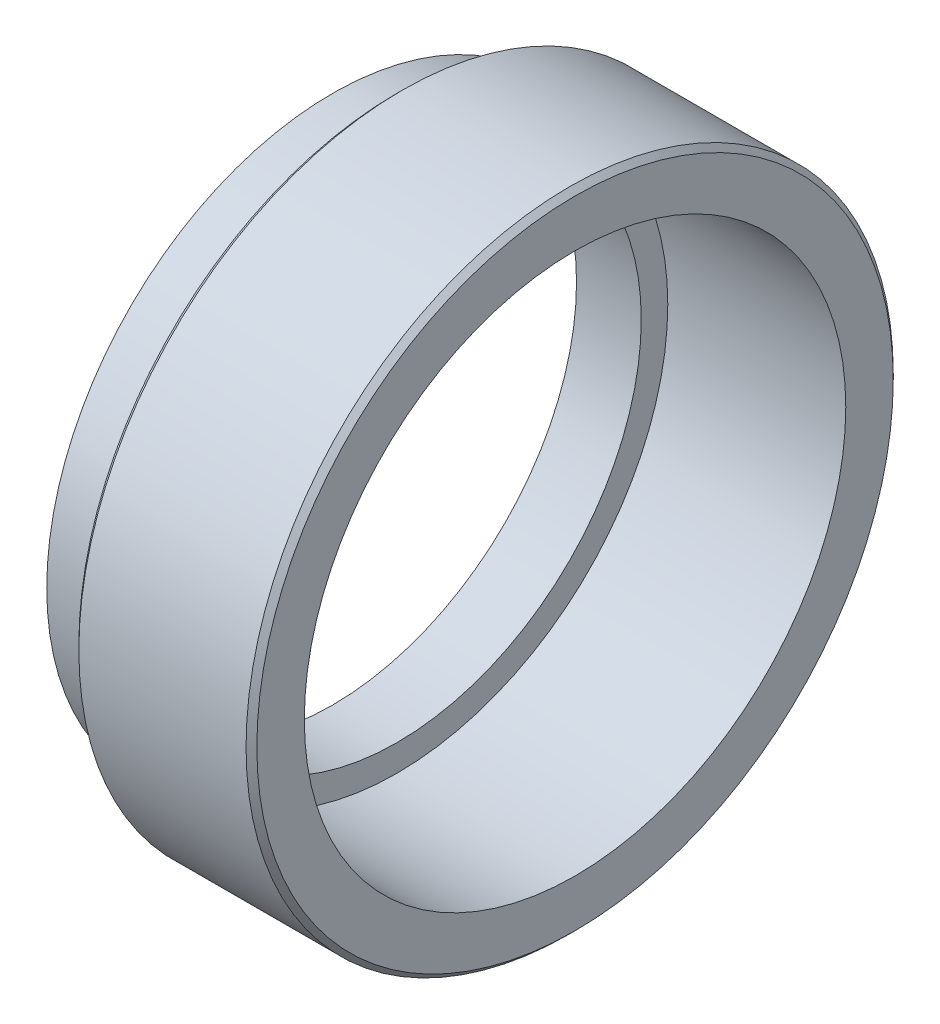
ISO-10303-21;
HEADER;
FILE_DESCRIPTION(('STEP AP214'),'2;1');
FILE_NAME('part.step','',(''),(''),'','','');
FILE_SCHEMA(('AUTOMOTIVE_DESIGN { 1 0 10303 214 1 1 1 1 }'));
ENDSEC;
DATA;
#1=APPLICATION_CONTEXT('core data for automotive mechanical design processes');
#2=APPLICATION_PROTOCOL_DEFINITION('international standard','automotive_design',2000,#1);
#3=PRODUCT_CONTEXT('',#1,'mechanical');
#4=PRODUCT('Part','Part','',(#3));
#5=PRODUCT_RELATED_PRODUCT_CATEGORY('part','',(#4));
#6=PRODUCT_DEFINITION_FORMATION('','',#4);
#7=PRODUCT_DEFINITION_CONTEXT('part definition',#1,'design');
#8=PRODUCT_DEFINITION('design','',#6,#7);
#9=PRODUCT_DEFINITION_SHAPE('','',#8);
#10=(LENGTH_UNIT() NAMED_UNIT(*) SI_UNIT(.MILLI.,.METRE.));
#11=(NAMED_UNIT(*) PLANE_ANGLE_UNIT() SI_UNIT($,.RADIAN.));
#12=(NAMED_UNIT(*) SI_UNIT($,.STERADIAN.) SOLID_ANGLE_UNIT());
#13=UNCERTAINTY_MEASURE_WITH_UNIT(LENGTH_MEASURE(1.E-05),#10,'distance_accuracy_value','');
#14=(GEOMETRIC_REPRESENTATION_CONTEXT(3) GLOBAL_UNCERTAINTY_ASSIGNED_CONTEXT((#13)) GLOBAL_UNIT_ASSIGNED_CONTEXT((#10,
#11,#12)) REPRESENTATION_CONTEXT('',''));
#15=CARTESIAN_POINT('',(0.,0.,0.));
#16=DIRECTION('',(0.,0.,1.));
#17=DIRECTION('',(1.,0.,0.));
#18=AXIS2_PLACEMENT_3D('',#15,#16,#17);
#19=CARTESIAN_POINT('',(0.,15.24,0.));
#20=DIRECTION('',(1.,0.,0.));
#21=DIRECTION('',(0.,0.,-1.));
#22=AXIS2_PLACEMENT_3D('',#19,#20,#21);
#23=PLANE('',#22);
#24=CARTESIAN_POINT('',(0.,0.,0.));
#25=DIRECTION('',(1.,0.,0.));
#26=DIRECTION('',(0.,0.,-1.));
#27=AXIS2_PLACEMENT_3D('',#24,#25,#26);
#28=CIRCLE('',#27,14.986);
#29=CARTESIAN_POINT('',(0.,0.,-14.986));
#30=VERTEX_POINT('',#29);
#31=EDGE_CURVE('E10',#30,#30,#28,.T.);
#32=ORIENTED_EDGE('',*,*,#31,.T.);
#33=EDGE_LOOP('',(#32));
#34=FACE_BOUND('',#33,.T.);
#35=CARTESIAN_POINT('',(0.,0.,0.));
#36=DIRECTION('',(1.,0.,0.));
#37=DIRECTION('',(0.,0.,-1.));
#38=AXIS2_PLACEMENT_3D('',#35,#36,#37);
#39=CIRCLE('',#38,12.75);
#40=CARTESIAN_POINT('',(0.,0.,-12.75));
#41=VERTEX_POINT('',#40);
#42=EDGE_CURVE('E66',#41,#41,#39,.T.);
#43=ORIENTED_EDGE('',*,*,#42,.F.);
#44=EDGE_LOOP('',(#43));
#45=FACE_BOUND('',#44,.T.);
#46=ADVANCED_FACE('F41',(#34,#45),#23,.T.);
#47=CARTESIAN_POINT('',(0.,0.,0.));
#48=DIRECTION('',(1.,0.,0.));
#49=DIRECTION('',(0.,0.,-1.));
#50=AXIS2_PLACEMENT_3D('',#47,#48,#49);
#51=CYLINDRICAL_SURFACE('',#50,15.24);
#52=CARTESIAN_POINT('',(-8.128,0.,0.));
#53=DIRECTION('',(-1.,0.,0.));
#54=DIRECTION('',(0.,0.,1.));
#55=AXIS2_PLACEMENT_3D('',#52,#53,#54);
#56=CIRCLE('',#55,15.24);
#57=CARTESIAN_POINT('',(-8.128,0.,15.24));
#58=VERTEX_POINT('',#57);
#59=EDGE_CURVE('E54',#58,#58,#56,.F.);
#60=ORIENTED_EDGE('',*,*,#59,.T.);
#61=EDGE_LOOP('',(#60));
#62=FACE_BOUND('',#61,.T.);
#63=CARTESIAN_POINT('',(-0.254000000000003,0.,0.));
#64=DIRECTION('',(1.,0.,0.));
#65=DIRECTION('',(0.,0.,-1.));
#66=AXIS2_PLACEMENT_3D('',#63,#64,#65);
#67=CIRCLE('',#66,15.24);
#68=CARTESIAN_POINT('',(-0.254000000000003,0.,-15.24));
#69=VERTEX_POINT('',#68);
#70=EDGE_CURVE('E60',#69,#69,#67,.F.);
#71=ORIENTED_EDGE('',*,*,#70,.T.);
#72=EDGE_LOOP('',(#71));
#73=FACE_BOUND('',#72,.T.);
#74=ADVANCED_FACE('F107',(#62,#73),#51,.T.);
#75=CARTESIAN_POINT('',(-11.43,13.1445,0.));
#76=DIRECTION('',(-1.,0.,0.));
#77=DIRECTION('',(0.,0.,1.));
#78=AXIS2_PLACEMENT_3D('',#75,#76,#77);
#79=PLANE('',#78);
#80=CARTESIAN_POINT('',(-11.43,0.,0.));
#81=DIRECTION('',(-1.,0.,0.));
#82=DIRECTION('',(0.,0.,1.));
#83=AXIS2_PLACEMENT_3D('',#80,#81,#82);
#84=CIRCLE('',#83,13.45);
#85=CARTESIAN_POINT('',(-11.43,0.,13.45));
#86=VERTEX_POINT('',#85);
#87=EDGE_CURVE('E69',#86,#86,#84,.T.);
#88=ORIENTED_EDGE('',*,*,#87,.T.);
#89=EDGE_LOOP('',(#88));
#90=FACE_BOUND('',#89,.T.);
#91=CARTESIAN_POINT('',(-11.43,0.,0.));
#92=DIRECTION('',(-1.,0.,0.));
#93=DIRECTION('',(0.,0.,1.));
#94=AXIS2_PLACEMENT_3D('',#91,#92,#93);
#95=CIRCLE('',#94,11.5);
#96=CARTESIAN_POINT('',(-11.43,0.,11.5));
#97=VERTEX_POINT('',#96);
#98=EDGE_CURVE('E78',#97,#97,#95,.T.);
#99=ORIENTED_EDGE('',*,*,#98,.F.);
#100=EDGE_LOOP('',(#99));
#101=FACE_BOUND('',#100,.T.);
#102=ADVANCED_FACE('F112',(#90,#101),#79,.T.);
#103=CARTESIAN_POINT('',(-8.128,0.,0.));
#104=DIRECTION('',(1.,0.,0.));
#105=DIRECTION('',(0.,0.,-1.));
#106=AXIS2_PLACEMENT_3D('',#103,#104,#105);
#107=CONICAL_SURFACE('',#106,15.24,0.785398163397452);
#108=CARTESIAN_POINT('',(-8.382,0.,0.));
#109=DIRECTION('',(-1.,0.,0.));
#110=DIRECTION('',(0.,0.,1.));
#111=AXIS2_PLACEMENT_3D('',#108,#109,#110);
#112=CIRCLE('',#111,14.986);
#113=CARTESIAN_POINT('',(-8.382,0.,14.986));
#114=VERTEX_POINT('',#113);
#115=EDGE_CURVE('E49',#114,#114,#112,.T.);
#116=ORIENTED_EDGE('',*,*,#115,.F.);
#117=EDGE_LOOP('',(#116));
#118=FACE_BOUND('',#117,.T.);
#119=ORIENTED_EDGE('',*,*,#59,.F.);
#120=EDGE_LOOP('',(#119));
#121=FACE_BOUND('',#120,.T.);
#122=ADVANCED_FACE('F103',(#118,#121),#107,.T.);
#123=CARTESIAN_POINT('',(0.,0.,0.));
#124=DIRECTION('',(-1.,0.,0.));
#125=DIRECTION('',(0.,0.,1.));
#126=AXIS2_PLACEMENT_3D('',#123,#124,#125);
#127=CONICAL_SURFACE('',#126,14.986,0.785398163397438);
#128=ORIENTED_EDGE('',*,*,#70,.F.);
#129=EDGE_LOOP('',(#128));
#130=FACE_BOUND('',#129,.T.);
#131=ORIENTED_EDGE('',*,*,#31,.F.);
#132=EDGE_LOOP('',(#131));
#133=FACE_BOUND('',#132,.T.);
#134=ADVANCED_FACE('F43',(#130,#133),#127,.T.);
#135=CARTESIAN_POINT('',(39.5979797464467,0.,0.));
#136=DIRECTION('',(-1.,0.,0.));
#137=DIRECTION('',(0.,0.,1.));
#138=AXIS2_PLACEMENT_3D('',#135,#136,#137);
#139=CYLINDRICAL_SURFACE('',#138,12.75);
#140=ORIENTED_EDGE('',*,*,#42,.T.);
#141=EDGE_LOOP('',(#140));
#142=FACE_BOUND('',#141,.T.);
#143=CARTESIAN_POINT('',(-8.382,0.,0.));
#144=DIRECTION('',(-1.,0.,0.));
#145=DIRECTION('',(0.,0.,1.));
#146=AXIS2_PLACEMENT_3D('',#143,#144,#145);
#147=CIRCLE('',#146,12.75);
#148=CARTESIAN_POINT('',(-8.382,0.,12.75));
#149=VERTEX_POINT('',#148);
#150=EDGE_CURVE('E82',#149,#149,#147,.F.);
#151=ORIENTED_EDGE('',*,*,#150,.F.);
#152=EDGE_LOOP('',(#151));
#153=FACE_BOUND('',#152,.T.);
#154=ADVANCED_FACE('F92',(#142,#153),#139,.F.);
#155=CARTESIAN_POINT('',(-49.4723448278363,0.,0.));
#156=DIRECTION('',(1.,0.,0.));
#157=DIRECTION('',(0.,0.,-1.));
#158=AXIS2_PLACEMENT_3D('',#155,#156,#157);
#159=CYLINDRICAL_SURFACE('',#158,13.45);
#160=CARTESIAN_POINT('',(-8.382,0.,0.));
#161=DIRECTION('',(-1.,0.,0.));
#162=DIRECTION('',(0.,0.,1.));
#163=AXIS2_PLACEMENT_3D('',#160,#161,#162);
#164=CIRCLE('',#163,13.45);
#165=CARTESIAN_POINT('',(-8.382,0.,13.45));
#166=VERTEX_POINT('',#165);
#167=EDGE_CURVE('E70',#166,#166,#164,.T.);
#168=ORIENTED_EDGE('',*,*,#167,.T.);
#169=EDGE_LOOP('',(#168));
#170=FACE_BOUND('',#169,.T.);
#171=ORIENTED_EDGE('',*,*,#87,.F.);
#172=EDGE_LOOP('',(#171));
#173=FACE_BOUND('',#172,.T.);
#174=ADVANCED_FACE('F94',(#170,#173),#159,.T.);
#175=CARTESIAN_POINT('',(-8.382,0.,0.));
#176=DIRECTION('',(-1.,0.,0.));
#177=DIRECTION('',(0.,0.,1.));
#178=AXIS2_PLACEMENT_3D('',#175,#176,#177);
#179=PLANE('',#178);
#180=CARTESIAN_POINT('',(-8.382,0.,0.));
#181=DIRECTION('',(-1.,0.,0.));
#182=DIRECTION('',(0.,0.,1.));
#183=AXIS2_PLACEMENT_3D('',#180,#181,#182);
#184=CIRCLE('',#183,11.5);
#185=CARTESIAN_POINT('',(-8.382,0.,11.5));
#186=VERTEX_POINT('',#185);
#187=EDGE_CURVE('E74',#186,#186,#184,.T.);
#188=ORIENTED_EDGE('',*,*,#187,.T.);
#189=EDGE_LOOP('',(#188));
#190=FACE_BOUND('',#189,.T.);
#191=ORIENTED_EDGE('',*,*,#150,.T.);
#192=EDGE_LOOP('',(#191));
#193=FACE_BOUND('',#192,.T.);
#194=ADVANCED_FACE('F90',(#190,#193),#179,.F.);
#195=CARTESIAN_POINT('',(-48.1995526217005,0.,0.));
#196=DIRECTION('',(1.,0.,0.));
#197=DIRECTION('',(0.,0.,-1.));
#198=AXIS2_PLACEMENT_3D('',#195,#196,#197);
#199=CYLINDRICAL_SURFACE('',#198,11.5);
#200=ORIENTED_EDGE('',*,*,#187,.F.);
#201=EDGE_LOOP('',(#200));
#202=FACE_BOUND('',#201,.T.);
#203=ORIENTED_EDGE('',*,*,#98,.T.);
#204=EDGE_LOOP('',(#203));
#205=FACE_BOUND('',#204,.T.);
#206=ADVANCED_FACE('F133',(#202,#205),#199,.F.);
#207=CARTESIAN_POINT('',(-8.382,15.24,0.));
#208=DIRECTION('',(-1.,0.,0.));
#209=DIRECTION('',(0.,0.,1.));
#210=AXIS2_PLACEMENT_3D('',#207,#208,#209);
#211=PLANE('',#210);
#212=ORIENTED_EDGE('',*,*,#167,.F.);
#213=EDGE_LOOP('',(#212));
#214=FACE_BOUND('',#213,.T.);
#215=ORIENTED_EDGE('',*,*,#115,.T.);
#216=EDGE_LOOP('',(#215));
#217=FACE_BOUND('',#216,.T.);
#218=ADVANCED_FACE('F131',(#214,#217),#211,.T.);
#219=CLOSED_SHELL('',(#46,#74,#102,#122,#134,#154,#174,#194,#206,#218));
#220=MANIFOLD_SOLID_BREP('B2',#219);
#221=ADVANCED_BREP_SHAPE_REPRESENTATION('',(#18,#220),#14);
#222=SHAPE_DEFINITION_REPRESENTATION(#9,#221);
ENDSEC;
END-ISO-10303-21;
